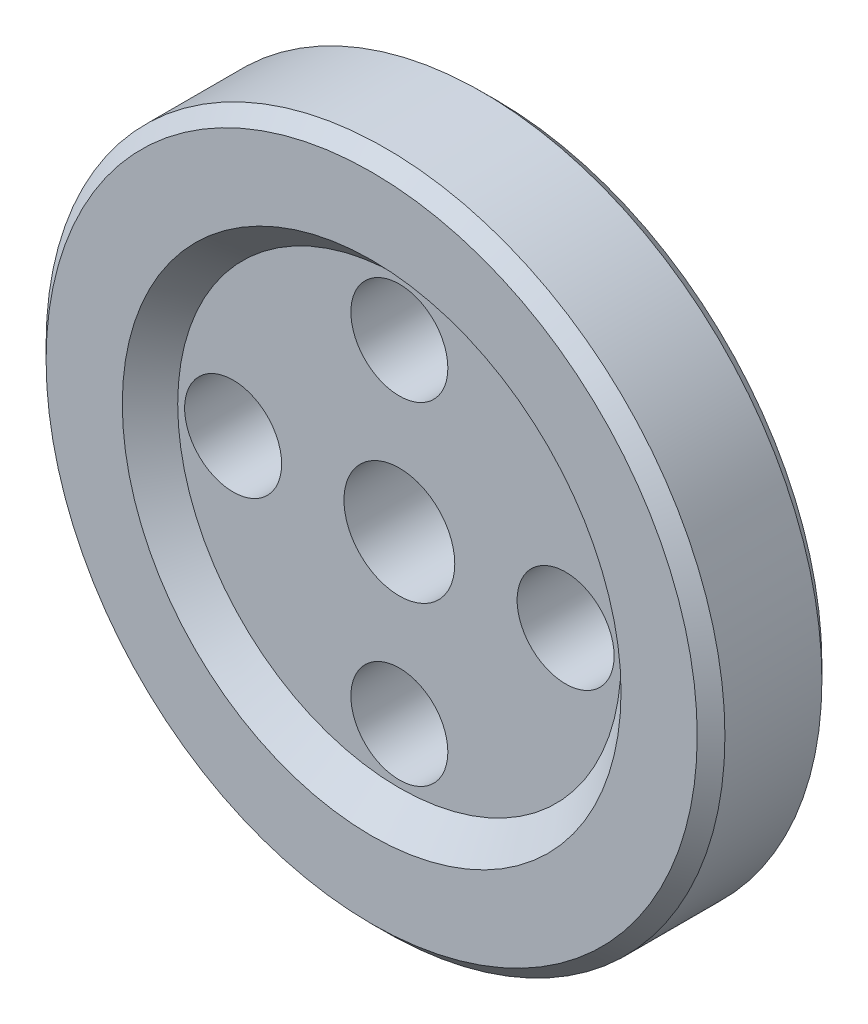
ISO-10303-21;
HEADER;
FILE_DESCRIPTION(('STEP AP214'),'2;1');
FILE_NAME('part.step','',(''),(''),'','','');
FILE_SCHEMA(('AUTOMOTIVE_DESIGN { 1 0 10303 214 1 1 1 1 }'));
ENDSEC;
DATA;
#1=APPLICATION_CONTEXT('core data for automotive mechanical design processes');
#2=APPLICATION_PROTOCOL_DEFINITION('international standard','automotive_design',2000,#1);
#3=PRODUCT_CONTEXT('',#1,'mechanical');
#4=PRODUCT('Part','Part','',(#3));
#5=PRODUCT_RELATED_PRODUCT_CATEGORY('part','',(#4));
#6=PRODUCT_DEFINITION_FORMATION('','',#4);
#7=PRODUCT_DEFINITION_CONTEXT('part definition',#1,'design');
#8=PRODUCT_DEFINITION('design','',#6,#7);
#9=PRODUCT_DEFINITION_SHAPE('','',#8);
#10=(LENGTH_UNIT() NAMED_UNIT(*) SI_UNIT(.MILLI.,.METRE.));
#11=(NAMED_UNIT(*) PLANE_ANGLE_UNIT() SI_UNIT($,.RADIAN.));
#12=(NAMED_UNIT(*) SI_UNIT($,.STERADIAN.) SOLID_ANGLE_UNIT());
#13=UNCERTAINTY_MEASURE_WITH_UNIT(LENGTH_MEASURE(1.E-05),#10,'distance_accuracy_value','');
#14=(GEOMETRIC_REPRESENTATION_CONTEXT(3) GLOBAL_UNCERTAINTY_ASSIGNED_CONTEXT((#13)) GLOBAL_UNIT_ASSIGNED_CONTEXT((#10,
#11,#12)) REPRESENTATION_CONTEXT('',''));
#15=CARTESIAN_POINT('',(0.,0.,0.));
#16=DIRECTION('',(0.,0.,1.));
#17=DIRECTION('',(1.,0.,0.));
#18=AXIS2_PLACEMENT_3D('',#15,#16,#17);
#19=CARTESIAN_POINT('',(0.,0.,9.));
#20=DIRECTION('',(0.,0.,1.));
#21=DIRECTION('',(1.,0.,0.));
#22=AXIS2_PLACEMENT_3D('',#19,#20,#21);
#23=PLANE('',#22);
#24=CARTESIAN_POINT('',(0.,0.,9.));
#25=DIRECTION('',(0.,0.,1.));
#26=DIRECTION('',(1.,0.,0.));
#27=AXIS2_PLACEMENT_3D('',#24,#25,#26);
#28=CIRCLE('',#27,18.);
#29=CARTESIAN_POINT('',(18.,0.,9.));
#30=VERTEX_POINT('',#29);
#31=EDGE_CURVE('E45',#30,#30,#28,.T.);
#32=ORIENTED_EDGE('',*,*,#31,.F.);
#33=EDGE_LOOP('',(#32));
#34=FACE_BOUND('',#33,.T.);
#35=CARTESIAN_POINT('',(0.,0.,9.));
#36=DIRECTION('',(0.,0.,-1.));
#37=DIRECTION('',(-1.,0.,0.));
#38=AXIS2_PLACEMENT_3D('',#35,#36,#37);
#39=CIRCLE('',#38,23.5);
#40=CARTESIAN_POINT('',(-23.5,0.,9.));
#41=VERTEX_POINT('',#40);
#42=EDGE_CURVE('E71',#41,#41,#39,.T.);
#43=ORIENTED_EDGE('',*,*,#42,.F.);
#44=EDGE_LOOP('',(#43));
#45=FACE_BOUND('',#44,.T.);
#46=ADVANCED_FACE('F38',(#34,#45),#23,.T.);
#47=CARTESIAN_POINT('',(0.,0.,0.));
#48=DIRECTION('',(0.,0.,1.));
#49=DIRECTION('',(1.,0.,0.));
#50=AXIS2_PLACEMENT_3D('',#47,#48,#49);
#51=PLANE('',#50);
#52=CARTESIAN_POINT('',(0.,12.,0.));
#53=DIRECTION('',(0.,0.,1.));
#54=DIRECTION('',(1.,0.,0.));
#55=AXIS2_PLACEMENT_3D('',#52,#53,#54);
#56=CIRCLE('',#55,3.5);
#57=CARTESIAN_POINT('',(3.5,12.,0.));
#58=VERTEX_POINT('',#57);
#59=EDGE_CURVE('E56',#58,#58,#56,.T.);
#60=ORIENTED_EDGE('',*,*,#59,.T.);
#61=EDGE_LOOP('',(#60));
#62=FACE_BOUND('',#61,.T.);
#63=CARTESIAN_POINT('',(12.,0.,0.));
#64=DIRECTION('',(0.,0.,1.));
#65=DIRECTION('',(1.,0.,0.));
#66=AXIS2_PLACEMENT_3D('',#63,#64,#65);
#67=CIRCLE('',#66,3.5);
#68=CARTESIAN_POINT('',(15.5,0.,0.));
#69=VERTEX_POINT('',#68);
#70=EDGE_CURVE('E60',#69,#69,#67,.T.);
#71=ORIENTED_EDGE('',*,*,#70,.T.);
#72=EDGE_LOOP('',(#71));
#73=FACE_BOUND('',#72,.T.);
#74=CARTESIAN_POINT('',(0.,-12.,0.));
#75=DIRECTION('',(0.,0.,1.));
#76=DIRECTION('',(1.,0.,0.));
#77=AXIS2_PLACEMENT_3D('',#74,#75,#76);
#78=CIRCLE('',#77,3.5);
#79=CARTESIAN_POINT('',(3.49999999999992,-12.,0.));
#80=VERTEX_POINT('',#79);
#81=EDGE_CURVE('E63',#80,#80,#78,.T.);
#82=ORIENTED_EDGE('',*,*,#81,.T.);
#83=EDGE_LOOP('',(#82));
#84=FACE_BOUND('',#83,.T.);
#85=CARTESIAN_POINT('',(-12.,1.25693328198353E-13,0.));
#86=DIRECTION('',(0.,0.,1.));
#87=DIRECTION('',(1.,0.,0.));
#88=AXIS2_PLACEMENT_3D('',#85,#86,#87);
#89=CIRCLE('',#88,3.5);
#90=CARTESIAN_POINT('',(-8.5,1.25693328198353E-13,0.));
#91=VERTEX_POINT('',#90);
#92=EDGE_CURVE('E66',#91,#91,#89,.T.);
#93=ORIENTED_EDGE('',*,*,#92,.T.);
#94=EDGE_LOOP('',(#93));
#95=FACE_BOUND('',#94,.T.);
#96=CARTESIAN_POINT('',(0.,0.,0.));
#97=DIRECTION('',(0.,0.,1.));
#98=DIRECTION('',(1.,0.,0.));
#99=AXIS2_PLACEMENT_3D('',#96,#97,#98);
#100=CIRCLE('',#99,4.);
#101=CARTESIAN_POINT('',(4.,0.,0.));
#102=VERTEX_POINT('',#101);
#103=EDGE_CURVE('E69',#102,#102,#100,.T.);
#104=ORIENTED_EDGE('',*,*,#103,.T.);
#105=EDGE_LOOP('',(#104));
#106=FACE_BOUND('',#105,.T.);
#107=CARTESIAN_POINT('',(0.,0.,0.));
#108=DIRECTION('',(0.,0.,-1.));
#109=DIRECTION('',(-1.,0.,0.));
#110=AXIS2_PLACEMENT_3D('',#107,#108,#109);
#111=CIRCLE('',#110,23.5);
#112=CARTESIAN_POINT('',(-23.5,0.,0.));
#113=VERTEX_POINT('',#112);
#114=EDGE_CURVE('E83',#113,#113,#111,.T.);
#115=ORIENTED_EDGE('',*,*,#114,.T.);
#116=EDGE_LOOP('',(#115));
#117=FACE_BOUND('',#116,.T.);
#118=ADVANCED_FACE('F105',(#62,#73,#84,#95,#106,#117),#51,.F.);
#119=CARTESIAN_POINT('',(0.,0.,7.));
#120=DIRECTION('',(0.,0.,1.));
#121=DIRECTION('',(1.,0.,0.));
#122=AXIS2_PLACEMENT_3D('',#119,#120,#121);
#123=PLANE('',#122);
#124=CARTESIAN_POINT('',(0.,12.,7.));
#125=DIRECTION('',(0.,0.,1.));
#126=DIRECTION('',(1.,0.,0.));
#127=AXIS2_PLACEMENT_3D('',#124,#125,#126);
#128=CIRCLE('',#127,3.5);
#129=CARTESIAN_POINT('',(3.5,12.,7.));
#130=VERTEX_POINT('',#129);
#131=EDGE_CURVE('E49',#130,#130,#128,.T.);
#132=ORIENTED_EDGE('',*,*,#131,.F.);
#133=EDGE_LOOP('',(#132));
#134=FACE_BOUND('',#133,.T.);
#135=CARTESIAN_POINT('',(12.,0.,7.));
#136=DIRECTION('',(0.,0.,1.));
#137=DIRECTION('',(1.,0.,0.));
#138=AXIS2_PLACEMENT_3D('',#135,#136,#137);
#139=CIRCLE('',#138,3.5);
#140=CARTESIAN_POINT('',(15.5,0.,7.));
#141=VERTEX_POINT('',#140);
#142=EDGE_CURVE('E53',#141,#141,#139,.T.);
#143=ORIENTED_EDGE('',*,*,#142,.F.);
#144=EDGE_LOOP('',(#143));
#145=FACE_BOUND('',#144,.T.);
#146=CARTESIAN_POINT('',(0.,-12.,7.));
#147=DIRECTION('',(0.,0.,1.));
#148=DIRECTION('',(1.,0.,0.));
#149=AXIS2_PLACEMENT_3D('',#146,#147,#148);
#150=CIRCLE('',#149,3.5);
#151=CARTESIAN_POINT('',(3.49999999999992,-12.,7.));
#152=VERTEX_POINT('',#151);
#153=EDGE_CURVE('E75',#152,#152,#150,.T.);
#154=ORIENTED_EDGE('',*,*,#153,.F.);
#155=EDGE_LOOP('',(#154));
#156=FACE_BOUND('',#155,.T.);
#157=CARTESIAN_POINT('',(-12.,1.25693328198353E-13,7.));
#158=DIRECTION('',(0.,0.,1.));
#159=DIRECTION('',(1.,0.,0.));
#160=AXIS2_PLACEMENT_3D('',#157,#158,#159);
#161=CIRCLE('',#160,3.5);
#162=CARTESIAN_POINT('',(-8.5,1.25693328198353E-13,7.));
#163=VERTEX_POINT('',#162);
#164=EDGE_CURVE('E78',#163,#163,#161,.T.);
#165=ORIENTED_EDGE('',*,*,#164,.F.);
#166=EDGE_LOOP('',(#165));
#167=FACE_BOUND('',#166,.T.);
#168=CARTESIAN_POINT('',(0.,0.,7.));
#169=DIRECTION('',(0.,0.,1.));
#170=DIRECTION('',(1.,0.,0.));
#171=AXIS2_PLACEMENT_3D('',#168,#169,#170);
#172=CIRCLE('',#171,4.);
#173=CARTESIAN_POINT('',(4.,0.,7.));
#174=VERTEX_POINT('',#173);
#175=EDGE_CURVE('E59',#174,#174,#172,.T.);
#176=ORIENTED_EDGE('',*,*,#175,.F.);
#177=EDGE_LOOP('',(#176));
#178=FACE_BOUND('',#177,.T.);
#179=CARTESIAN_POINT('',(0.,0.,7.));
#180=DIRECTION('',(0.,0.,1.));
#181=DIRECTION('',(1.,0.,0.));
#182=AXIS2_PLACEMENT_3D('',#179,#180,#181);
#183=CIRCLE('',#182,16.);
#184=CARTESIAN_POINT('',(16.,0.,7.));
#185=VERTEX_POINT('',#184);
#186=EDGE_CURVE('E11',#185,#185,#183,.F.);
#187=ORIENTED_EDGE('',*,*,#186,.F.);
#188=EDGE_LOOP('',(#187));
#189=FACE_BOUND('',#188,.T.);
#190=ADVANCED_FACE('F111',(#134,#145,#156,#167,#178,#189),#123,.T.);
#191=CARTESIAN_POINT('',(0.,12.,7.));
#192=DIRECTION('',(0.,0.,-1.));
#193=DIRECTION('',(-1.,0.,0.));
#194=AXIS2_PLACEMENT_3D('',#191,#192,#193);
#195=CYLINDRICAL_SURFACE('',#194,3.5);
#196=ORIENTED_EDGE('',*,*,#131,.T.);
#197=EDGE_LOOP('',(#196));
#198=FACE_BOUND('',#197,.T.);
#199=ORIENTED_EDGE('',*,*,#59,.F.);
#200=EDGE_LOOP('',(#199));
#201=FACE_BOUND('',#200,.T.);
#202=ADVANCED_FACE('F130',(#198,#201),#195,.F.);
#203=CARTESIAN_POINT('',(12.,0.,7.));
#204=DIRECTION('',(0.,0.,-1.));
#205=DIRECTION('',(-1.,0.,0.));
#206=AXIS2_PLACEMENT_3D('',#203,#204,#205);
#207=CYLINDRICAL_SURFACE('',#206,3.5);
#208=ORIENTED_EDGE('',*,*,#142,.T.);
#209=EDGE_LOOP('',(#208));
#210=FACE_BOUND('',#209,.T.);
#211=ORIENTED_EDGE('',*,*,#70,.F.);
#212=EDGE_LOOP('',(#211));
#213=FACE_BOUND('',#212,.T.);
#214=ADVANCED_FACE('F126',(#210,#213),#207,.F.);
#215=CARTESIAN_POINT('',(0.,-12.,7.));
#216=DIRECTION('',(0.,0.,-1.));
#217=DIRECTION('',(-1.,0.,0.));
#218=AXIS2_PLACEMENT_3D('',#215,#216,#217);
#219=CYLINDRICAL_SURFACE('',#218,3.5);
#220=ORIENTED_EDGE('',*,*,#153,.T.);
#221=EDGE_LOOP('',(#220));
#222=FACE_BOUND('',#221,.T.);
#223=ORIENTED_EDGE('',*,*,#81,.F.);
#224=EDGE_LOOP('',(#223));
#225=FACE_BOUND('',#224,.T.);
#226=ADVANCED_FACE('F122',(#222,#225),#219,.F.);
#227=CARTESIAN_POINT('',(-12.,1.25693328198353E-13,7.));
#228=DIRECTION('',(0.,0.,-1.));
#229=DIRECTION('',(-1.,0.,0.));
#230=AXIS2_PLACEMENT_3D('',#227,#228,#229);
#231=CYLINDRICAL_SURFACE('',#230,3.5);
#232=ORIENTED_EDGE('',*,*,#164,.T.);
#233=EDGE_LOOP('',(#232));
#234=FACE_BOUND('',#233,.T.);
#235=ORIENTED_EDGE('',*,*,#92,.F.);
#236=EDGE_LOOP('',(#235));
#237=FACE_BOUND('',#236,.T.);
#238=ADVANCED_FACE('F118',(#234,#237),#231,.F.);
#239=CARTESIAN_POINT('',(0.,0.,7.));
#240=DIRECTION('',(0.,0.,-1.));
#241=DIRECTION('',(-1.,0.,0.));
#242=AXIS2_PLACEMENT_3D('',#239,#240,#241);
#243=CYLINDRICAL_SURFACE('',#242,4.);
#244=ORIENTED_EDGE('',*,*,#175,.T.);
#245=EDGE_LOOP('',(#244));
#246=FACE_BOUND('',#245,.T.);
#247=ORIENTED_EDGE('',*,*,#103,.F.);
#248=EDGE_LOOP('',(#247));
#249=FACE_BOUND('',#248,.T.);
#250=ADVANCED_FACE('F114',(#246,#249),#243,.F.);
#251=CARTESIAN_POINT('',(0.,0.,9.));
#252=DIRECTION('',(0.,0.,1.));
#253=DIRECTION('',(1.,0.,0.));
#254=AXIS2_PLACEMENT_3D('',#251,#252,#253);
#255=CONICAL_SURFACE('',#254,18.,0.785398163397446);
#256=ORIENTED_EDGE('',*,*,#186,.T.);
#257=EDGE_LOOP('',(#256));
#258=FACE_BOUND('',#257,.T.);
#259=ORIENTED_EDGE('',*,*,#31,.T.);
#260=EDGE_LOOP('',(#259));
#261=FACE_BOUND('',#260,.T.);
#262=ADVANCED_FACE('F117',(#258,#261),#255,.F.);
#263=CARTESIAN_POINT('',(0.,0.,0.99999999999999));
#264=DIRECTION('',(0.,0.,1.));
#265=DIRECTION('',(1.,0.,0.));
#266=AXIS2_PLACEMENT_3D('',#263,#264,#265);
#267=CONICAL_SURFACE('',#266,24.5,0.785398163397453);
#268=ORIENTED_EDGE('',*,*,#114,.F.);
#269=EDGE_LOOP('',(#268));
#270=FACE_BOUND('',#269,.T.);
#271=CARTESIAN_POINT('',(0.,0.,0.99999999999999));
#272=DIRECTION('',(0.,0.,-1.));
#273=DIRECTION('',(-1.,0.,0.));
#274=AXIS2_PLACEMENT_3D('',#271,#272,#273);
#275=CIRCLE('',#274,24.5);
#276=CARTESIAN_POINT('',(-24.5,0.,0.99999999999999));
#277=VERTEX_POINT('',#276);
#278=EDGE_CURVE('E87',#277,#277,#275,.T.);
#279=ORIENTED_EDGE('',*,*,#278,.T.);
#280=EDGE_LOOP('',(#279));
#281=FACE_BOUND('',#280,.T.);
#282=ADVANCED_FACE('F100',(#270,#281),#267,.T.);
#283=CARTESIAN_POINT('',(0.,0.,9.));
#284=DIRECTION('',(0.,0.,-1.));
#285=DIRECTION('',(-1.,0.,0.));
#286=AXIS2_PLACEMENT_3D('',#283,#284,#285);
#287=CONICAL_SURFACE('',#286,23.5,0.785398163397447);
#288=CARTESIAN_POINT('',(0.,0.,7.99999999999999));
#289=DIRECTION('',(0.,0.,-1.));
#290=DIRECTION('',(-1.,0.,0.));
#291=AXIS2_PLACEMENT_3D('',#288,#289,#290);
#292=CIRCLE('',#291,24.5);
#293=CARTESIAN_POINT('',(-24.5,0.,7.99999999999999));
#294=VERTEX_POINT('',#293);
#295=EDGE_CURVE('E86',#294,#294,#292,.T.);
#296=ORIENTED_EDGE('',*,*,#295,.F.);
#297=EDGE_LOOP('',(#296));
#298=FACE_BOUND('',#297,.T.);
#299=ORIENTED_EDGE('',*,*,#42,.T.);
#300=EDGE_LOOP('',(#299));
#301=FACE_BOUND('',#300,.T.);
#302=ADVANCED_FACE('F97',(#298,#301),#287,.T.);
#303=CARTESIAN_POINT('',(0.,0.,9.));
#304=DIRECTION('',(0.,0.,-1.));
#305=DIRECTION('',(-1.,0.,0.));
#306=AXIS2_PLACEMENT_3D('',#303,#304,#305);
#307=CYLINDRICAL_SURFACE('',#306,24.5);
#308=ORIENTED_EDGE('',*,*,#295,.T.);
#309=EDGE_LOOP('',(#308));
#310=FACE_BOUND('',#309,.T.);
#311=ORIENTED_EDGE('',*,*,#278,.F.);
#312=EDGE_LOOP('',(#311));
#313=FACE_BOUND('',#312,.T.);
#314=ADVANCED_FACE('F40',(#310,#313),#307,.T.);
#315=CLOSED_SHELL('',(#46,#118,#190,#202,#214,#226,#238,#250,#262,#282,#302,#314));
#316=MANIFOLD_SOLID_BREP('B2',#315);
#317=ADVANCED_BREP_SHAPE_REPRESENTATION('',(#18,#316),#14);
#318=SHAPE_DEFINITION_REPRESENTATION(#9,#317);
ENDSEC;
END-ISO-10303-21;
